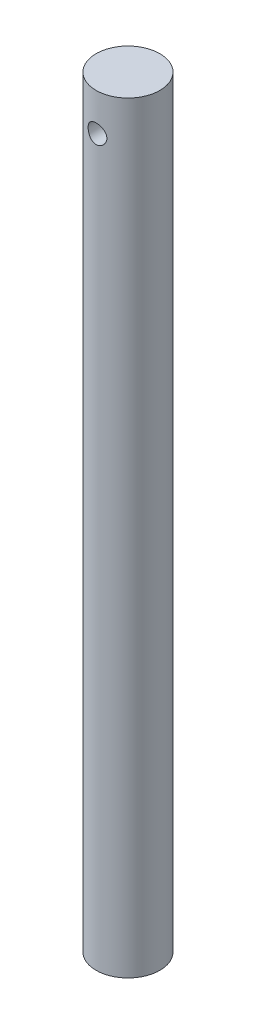
ISO-10303-21;
HEADER;
FILE_DESCRIPTION(('STEP AP214'),'2;1');
FILE_NAME('part.step','',(''),(''),'','','');
FILE_SCHEMA(('AUTOMOTIVE_DESIGN { 1 0 10303 214 1 1 1 1 }'));
ENDSEC;
DATA;
#1=APPLICATION_CONTEXT('core data for automotive mechanical design processes');
#2=APPLICATION_PROTOCOL_DEFINITION('international standard','automotive_design',2000,#1);
#3=PRODUCT_CONTEXT('',#1,'mechanical');
#4=PRODUCT('Part','Part','',(#3));
#5=PRODUCT_RELATED_PRODUCT_CATEGORY('part','',(#4));
#6=PRODUCT_DEFINITION_FORMATION('','',#4);
#7=PRODUCT_DEFINITION_CONTEXT('part definition',#1,'design');
#8=PRODUCT_DEFINITION('design','',#6,#7);
#9=PRODUCT_DEFINITION_SHAPE('','',#8);
#10=(LENGTH_UNIT() NAMED_UNIT(*) SI_UNIT(.MILLI.,.METRE.));
#11=(NAMED_UNIT(*) PLANE_ANGLE_UNIT() SI_UNIT($,.RADIAN.));
#12=(NAMED_UNIT(*) SI_UNIT($,.STERADIAN.) SOLID_ANGLE_UNIT());
#13=UNCERTAINTY_MEASURE_WITH_UNIT(LENGTH_MEASURE(1.E-05),#10,'distance_accuracy_value','');
#14=(GEOMETRIC_REPRESENTATION_CONTEXT(3) GLOBAL_UNCERTAINTY_ASSIGNED_CONTEXT((#13)) GLOBAL_UNIT_ASSIGNED_CONTEXT((#10,
#11,#12)) REPRESENTATION_CONTEXT('',''));
#15=CARTESIAN_POINT('',(0.,0.,0.));
#16=DIRECTION('',(0.,0.,1.));
#17=DIRECTION('',(1.,0.,0.));
#18=AXIS2_PLACEMENT_3D('',#15,#16,#17);
#19=CARTESIAN_POINT('',(0.,203.2,0.));
#20=DIRECTION('',(0.,-1.,0.));
#21=DIRECTION('',(0.,0.,-1.));
#22=AXIS2_PLACEMENT_3D('',#19,#20,#21);
#23=CYLINDRICAL_SURFACE('',#22,8.5);
#24=CARTESIAN_POINT('',(2.5,193.2,8.12403840463596));
#25=CARTESIAN_POINT('',(2.49999796236333,193.062873852835,8.12404004769227));
#26=CARTESIAN_POINT('',(2.48867946345813,192.925727422779,8.12754823490023));
#27=CARTESIAN_POINT('',(2.44381537502387,192.655435183069,8.14114853701026));
#28=CARTESIAN_POINT('',(2.41026169208832,192.522290848594,8.15124304925464));
#29=CARTESIAN_POINT('',(2.32215786618519,192.263954163762,8.1767759728757));
#30=CARTESIAN_POINT('',(2.26764163496267,192.138749348537,8.19220574919405));
#31=CARTESIAN_POINT('',(2.13927079722776,191.899233967044,8.22665909626877));
#32=CARTESIAN_POINT('',(2.06541354228249,191.784924895693,8.2456831591037));
#33=CARTESIAN_POINT('',(1.89805242493169,191.56696890822,8.28583044324545));
#34=CARTESIAN_POINT('',(1.80406342823792,191.463702417056,8.30699705220536));
#35=CARTESIAN_POINT('',(1.60014717785515,191.274146555187,8.34867315787303));
#36=CARTESIAN_POINT('',(1.49021795590314,191.187859284143,8.36918257304957));
#37=CARTESIAN_POINT('',(1.25484804530033,191.033071443225,8.40772468697269));
#38=CARTESIAN_POINT('',(1.12914327438481,190.964956976682,8.42570029093119));
#39=CARTESIAN_POINT('',(0.867445637031216,190.85098011761,8.45664648715187));
#40=CARTESIAN_POINT('',(0.731454905756552,190.805113121516,8.46961811474953));
#41=CARTESIAN_POINT('',(0.457024005838443,190.738187024873,8.48878785171354));
#42=CARTESIAN_POINT('',(0.318754673888333,190.716478972153,8.49516280971316));
#43=CARTESIAN_POINT('',(0.0403993943316189,190.696436873884,8.50104289513883));
#44=CARTESIAN_POINT('',(-0.0996861803221935,190.698098103248,8.50054941131059));
#45=CARTESIAN_POINT('',(-0.373151342435315,190.724307858585,8.49287406928416));
#46=CARTESIAN_POINT('',(-0.506604918733651,190.748153938971,8.48589749488645));
#47=CARTESIAN_POINT('',(-0.767524842762465,190.816911381903,8.46628800888346));
#48=CARTESIAN_POINT('',(-0.894990816659905,190.861824057814,8.45365474462275));
#49=CARTESIAN_POINT('',(-1.14200961129054,190.971926750607,8.42386378069359));
#50=CARTESIAN_POINT('',(-1.26145611323967,191.037341279239,8.40665632319236));
#51=CARTESIAN_POINT('',(-1.48790420805442,191.186414256184,8.3695475929186));
#52=CARTESIAN_POINT('',(-1.59490293229939,191.270076897098,8.34964570148467));
#53=CARTESIAN_POINT('',(-1.79761108283251,191.456930639675,8.30841132230748));
#54=CARTESIAN_POINT('',(-1.89275419933162,191.560731233555,8.28705315309199));
#55=CARTESIAN_POINT('',(-2.06443893360173,191.783025564592,8.24596298173467));
#56=CARTESIAN_POINT('',(-2.14097884894606,191.901520644982,8.2262311285303));
#57=CARTESIAN_POINT('',(-2.27384467334688,192.151282152895,8.190508316972));
#58=CARTESIAN_POINT('',(-2.32998458403206,192.282652874725,8.17455222141957));
#59=CARTESIAN_POINT('',(-2.41918075403472,192.553560502861,8.14860398612285));
#60=CARTESIAN_POINT('',(-2.45224420125603,192.693094851654,8.13860998943288));
#61=CARTESIAN_POINT('',(-2.49330571013839,192.970995992175,8.12612291499099));
#62=CARTESIAN_POINT('',(-2.50216167789634,193.109224603975,8.12337323394746));
#63=CARTESIAN_POINT('',(-2.49694674077671,193.38519477837,8.12497791371988));
#64=CARTESIAN_POINT('',(-2.48287889750256,193.522936403543,8.12933132587803));
#65=CARTESIAN_POINT('',(-2.43297838264223,193.790495744733,8.14440053150527));
#66=CARTESIAN_POINT('',(-2.39769132906183,193.920425118724,8.15495668098142));
#67=CARTESIAN_POINT('',(-2.30698314161101,194.172512602256,8.18107827684707));
#68=CARTESIAN_POINT('',(-2.25155898239259,194.294669540843,8.19664447589366));
#69=CARTESIAN_POINT('',(-2.12050182351162,194.531252226319,8.23153516861892));
#70=CARTESIAN_POINT('',(-2.04438129566146,194.645394737546,8.25094678118232));
#71=CARTESIAN_POINT('',(-1.87467572806314,194.859599956246,8.29115078956271));
#72=CARTESIAN_POINT('',(-1.78108667259489,194.959659416967,8.31194350216197));
#73=CARTESIAN_POINT('',(-1.5750791637806,195.146575157079,8.35347468056185));
#74=CARTESIAN_POINT('',(-1.46210326579578,195.232824962063,8.37418413333273));
#75=CARTESIAN_POINT('',(-1.22279215701974,195.385152819897,8.4124574775909));
#76=CARTESIAN_POINT('',(-1.0964576273572,195.451231900544,8.43002152933273));
#77=CARTESIAN_POINT('',(-0.83486970079801,195.560706524561,8.45991559483805));
#78=CARTESIAN_POINT('',(-0.699692499333715,195.604272872726,8.47228488292635));
#79=CARTESIAN_POINT('',(-0.423508369003444,195.667936053035,8.49056923502441));
#80=CARTESIAN_POINT('',(-0.28250304845032,195.688039315809,8.49648606745733));
#81=CARTESIAN_POINT('',(-0.00428063265452223,195.703732149907,8.50109557993595));
#82=CARTESIAN_POINT('',(0.132883087997766,195.700202944985,8.5000479658633));
#83=CARTESIAN_POINT('',(0.40457987902751,195.670826481531,8.49145383826406));
#84=CARTESIAN_POINT('',(0.539113088331977,195.644980404908,8.48390766890344));
#85=CARTESIAN_POINT('',(0.800430062071601,195.572241393431,8.46323443524756));
#86=CARTESIAN_POINT('',(0.92727771497263,195.525560861568,8.45016376169147));
#87=CARTESIAN_POINT('',(1.17140848295971,195.412667454099,8.41979522614635));
#88=CARTESIAN_POINT('',(1.28869005835389,195.34645144208,8.40249668545172));
#89=CARTESIAN_POINT('',(1.51431862183008,195.1939784527,8.36482735062435));
#90=CARTESIAN_POINT('',(1.62227473752418,195.107162667301,8.34437779354528));
#91=CARTESIAN_POINT('',(1.82238178255149,194.916970534231,8.30297459267524));
#92=CARTESIAN_POINT('',(1.91452822302222,194.813589499227,8.28202080763743));
#93=CARTESIAN_POINT('',(2.08301441277004,194.589686707217,8.24128575203088));
#94=CARTESIAN_POINT('',(2.1588327454279,194.468762509931,8.22155447762225));
#95=CARTESIAN_POINT('',(2.28897091376096,194.215322127327,8.18628031678096));
#96=CARTESIAN_POINT('',(2.34330180082887,194.082811943833,8.17073527860536));
#97=CARTESIAN_POINT('',(2.4236098697108,193.826106943865,8.14724808486323));
#98=CARTESIAN_POINT('',(2.45217950771626,193.702780757797,8.13862442212331));
#99=CARTESIAN_POINT('',(2.49037379107053,193.452975082965,8.12701933690399));
#100=CARTESIAN_POINT('',(2.50000187967973,193.326496171548,8.12403688894885));
#101=CARTESIAN_POINT('',(2.5,193.2,8.12403840463596));
#102=B_SPLINE_CURVE_WITH_KNOTS('',3,(#24,#25,#26,#27,#28,#29,#30,#31,#32,#33,#34,#35,#36,#37,
#38,#39,#40,#41,#42,#43,#44,#45,#46,#47,#48,#49,#50,#51,#52,#53,#54,#55,#56,#57,#58,#59,#60,#61,
#62,#63,#64,#65,#66,#67,#68,#69,#70,#71,#72,#73,#74,#75,#76,#77,#78,#79,#80,#81,#82,#83,#84,#85,
#86,#87,#88,#89,#90,#91,#92,#93,#94,#95,#96,#97,#98,#99,#100,#101),.UNSPECIFIED.,.T.,.F.,(4,2,2,
2,2,2,2,2,2,2,2,2,2,2,2,2,2,2,2,2,2,2,2,2,2,2,2,2,2,2,2,2,2,2,2,2,2,2,4),(0.,0.410912099878071,
0.821973850269874,1.23237339254287,1.64282916164921,2.06459109250966,2.48640514599762,
2.91657307890351,3.34665196116879,3.76487622839168,4.18301593513791,4.58835076674875,
4.9937108716974,5.4036749647982,5.81373334874933,6.23900922160109,6.66432399789826,
7.09342468655066,7.52239165832585,7.93594602558852,8.34944516487447,8.75274111013304,
9.15609767062929,9.56993137756289,9.98386033532176,10.4127208011549,10.8415594108246,
11.2670947877504,11.6925135089525,12.1021596149396,12.5117840272457,12.9173245470081,
13.3229302115836,13.7411394840136,14.1594673033652,14.5896395325794,15.0195902276006,
15.3987174767159,15.7777758003976),.UNSPECIFIED.);
#103=CARTESIAN_POINT('',(2.5,193.2,8.12403840463596));
#104=VERTEX_POINT('',#103);
#105=EDGE_CURVE('E40',#104,#104,#102,.T.);
#106=ORIENTED_EDGE('',*,*,#105,.T.);
#107=EDGE_LOOP('',(#106));
#108=FACE_BOUND('',#107,.T.);
#109=CARTESIAN_POINT('',(0.,195.7,-8.5));
#110=CARTESIAN_POINT('',(-0.137271087727495,195.699998009457,-8.49999861984563));
#111=CARTESIAN_POINT('',(-0.274562388524357,195.688656416097,-8.49664273790941));
#112=CARTESIAN_POINT('',(-0.545154790258969,195.64369228964,-8.48358293092289));
#113=CARTESIAN_POINT('',(-0.678454552902891,195.610062369172,-8.47387690115711));
#114=CARTESIAN_POINT('',(-0.937121397424162,195.52173584907,-8.44918175691691));
#115=CARTESIAN_POINT('',(-1.06249961390222,195.467069621409,-8.4342002617338));
#116=CARTESIAN_POINT('',(-1.30231013795625,195.338344642843,-8.40051609595062));
#117=CARTESIAN_POINT('',(-1.41674111478709,195.264283538379,-8.38181297379899));
#118=CARTESIAN_POINT('',(-1.63457916116328,195.096708257565,-8.34210560637238));
#119=CARTESIAN_POINT('',(-1.73764002919375,195.002754904256,-8.32105559723633));
#120=CARTESIAN_POINT('',(-1.9267934781298,194.798998624703,-8.27930364822076));
#121=CARTESIAN_POINT('',(-2.01288333630681,194.689193160127,-8.25860176467897));
#122=CARTESIAN_POINT('',(-2.16744780421675,194.453951057519,-8.21940889423452));
#123=CARTESIAN_POINT('',(-2.23550435462777,194.328229344143,-8.20097494362387));
#124=CARTESIAN_POINT('',(-2.34936967141106,194.066496243712,-8.16908706562412));
#125=CARTESIAN_POINT('',(-2.39518354658733,193.930487227798,-8.15563199483111));
#126=CARTESIAN_POINT('',(-2.4620230904679,193.6559185785,-8.13570140468483));
#127=CARTESIAN_POINT('',(-2.48368513263949,193.517527179815,-8.12904710882195));
#128=CARTESIAN_POINT('',(-2.50359273858352,193.23892679982,-8.12293921380092));
#129=CARTESIAN_POINT('',(-2.50184372926459,193.098718247273,-8.12348394583797));
#130=CARTESIAN_POINT('',(-2.47547970423777,192.825599058342,-8.1315538217463));
#131=CARTESIAN_POINT('',(-2.45165677002291,192.692603643464,-8.13883715033043));
#132=CARTESIAN_POINT('',(-2.38309882975619,192.432587236949,-8.15917310643882));
#133=CARTESIAN_POINT('',(-2.33836183223036,192.305566815528,-8.17222628337175));
#134=CARTESIAN_POINT('',(-2.22865105602403,192.059145354335,-8.20282771250157));
#135=CARTESIAN_POINT('',(-2.1634166038604,191.939867796497,-8.22043331779315));
#136=CARTESIAN_POINT('',(-2.01474396039616,191.713684624634,-8.25812773273612));
#137=CARTESIAN_POINT('',(-1.93130150587336,191.606781917043,-8.27821712346286));
#138=CARTESIAN_POINT('',(-1.74462617541447,191.403884132737,-8.31960105269041));
#139=CARTESIAN_POINT('',(-1.64073447444152,191.308497468825,-8.34091163205923));
#140=CARTESIAN_POINT('',(-1.41816455436526,191.13636198606,-8.381622169105));
#141=CARTESIAN_POINT('',(-1.29948547582089,191.059614251266,-8.40102201561289));
#142=CARTESIAN_POINT('',(-1.04963424378285,190.926584980096,-8.43589091064938));
#143=CARTESIAN_POINT('',(-0.918388927530007,190.870433804769,-8.4513347411375));
#144=CARTESIAN_POINT('',(-0.647758832686872,190.78117897428,-8.47636980535785));
#145=CARTESIAN_POINT('',(-0.50837624371238,190.748069149743,-8.48596260563203));
#146=CARTESIAN_POINT('',(-0.230604068870085,190.706839110804,-8.4979689702563));
#147=CARTESIAN_POINT('',(-0.092346999228584,190.697893865124,-8.50061946024052));
#148=CARTESIAN_POINT('',(0.183699522477687,190.702940732752,-8.49913508852595));
#149=CARTESIAN_POINT('',(0.321489032058248,190.716929914153,-8.49500109414636));
#150=CARTESIAN_POINT('',(0.589606356734289,190.76677944425,-8.48056702277198));
#151=CARTESIAN_POINT('',(0.720030997169925,190.802161742012,-8.47040180981073));
#152=CARTESIAN_POINT('',(0.973067590228202,190.89322167692,-8.44507681715343));
#153=CARTESIAN_POINT('',(1.09567861561037,190.948901717547,-8.42991644599505));
#154=CARTESIAN_POINT('',(1.33267472471046,191.080387898657,-8.39575167626283));
#155=CARTESIAN_POINT('',(1.44681224267531,191.156619214139,-8.37666836767037));
#156=CARTESIAN_POINT('',(1.66095780157527,191.326524220165,-8.3368520682965));
#157=CARTESIAN_POINT('',(1.76096242617874,191.420202115414,-8.3161186805298));
#158=CARTESIAN_POINT('',(1.94760844001463,191.626214071631,-8.27443627897487));
#159=CARTESIAN_POINT('',(2.03366352285072,191.739084012757,-8.2535048797977));
#160=CARTESIAN_POINT('',(2.18564758513575,191.978116372239,-8.21456767827428));
#161=CARTESIAN_POINT('',(2.25157717122358,192.104278389782,-8.19656178775266));
#162=CARTESIAN_POINT('',(2.36097355864955,192.365857278367,-8.16572337156381));
#163=CARTESIAN_POINT('',(2.40455162576546,192.50122443153,-8.15286529179189));
#164=CARTESIAN_POINT('',(2.46817463572475,192.777821158248,-8.13383292382002));
#165=CARTESIAN_POINT('',(2.48822724822325,192.919048805639,-8.12765645736396));
#166=CARTESIAN_POINT('',(2.50372273821178,193.197283759396,-8.12289540762687));
#167=CARTESIAN_POINT('',(2.50011873506142,193.334233664506,-8.12401678018334));
#168=CARTESIAN_POINT('',(2.47066658625237,193.605482269575,-8.13302148912631));
#169=CARTESIAN_POINT('',(2.44481926783808,193.739781067941,-8.14090457403997));
#170=CARTESIAN_POINT('',(2.37221858991634,194.000423589527,-8.16235114097488));
#171=CARTESIAN_POINT('',(2.32570829969428,194.126840860984,-8.1758484654058));
#172=CARTESIAN_POINT('',(2.21329051947503,194.370178386097,-8.20699285495302));
#173=CARTESIAN_POINT('',(2.14737943045436,194.487096872503,-8.22464068990431));
#174=CARTESIAN_POINT('',(1.99531510587088,194.712564541071,-8.26287240673951));
#175=CARTESIAN_POINT('',(1.90853150291959,194.820674777888,-8.28353771793409));
#176=CARTESIAN_POINT('',(1.71833198876268,195.021106914135,-8.32507032743605));
#177=CARTESIAN_POINT('',(1.61491181950039,195.113424759056,-8.34593767616557));
#178=CARTESIAN_POINT('',(1.39092065602785,195.282196041117,-8.38621639202544));
#179=CARTESIAN_POINT('',(1.26995371609996,195.358138793326,-8.40557136656934));
#180=CARTESIAN_POINT('',(1.01639937119367,195.488499215351,-8.43997966669156));
#181=CARTESIAN_POINT('',(0.883817828157913,195.54292766794,-8.45503514608528));
#182=CARTESIAN_POINT('',(0.626887616598632,195.623417754159,-8.47771488552966));
#183=CARTESIAN_POINT('',(0.503401139075293,195.652060424325,-8.48600430120501));
#184=CARTESIAN_POINT('',(0.25328185434428,195.690351016371,-8.49714708039866));
#185=CARTESIAN_POINT('',(0.126649530199161,195.700001836521,-8.50000127336285));
#186=CARTESIAN_POINT('',(0.,195.7,-8.5));
#187=B_SPLINE_CURVE_WITH_KNOTS('',3,(#109,#110,#111,#112,#113,#114,#115,#116,#117,#118,#119,
#120,#121,#122,#123,#124,#125,#126,#127,#128,#129,#130,#131,#132,#133,#134,#135,#136,#137,#138,
#139,#140,#141,#142,#143,#144,#145,#146,#147,#148,#149,#150,#151,#152,#153,#154,#155,#156,#157,
#158,#159,#160,#161,#162,#163,#164,#165,#166,#167,#168,#169,#170,#171,#172,#173,#174,#175,#176,
#177,#178,#179,#180,#181,#182,#183,#184,#185,#186),.UNSPECIFIED.,.T.,.F.,(4,2,2,2,2,2,2,2,2,2,2,
2,2,2,2,2,2,2,2,2,2,2,2,2,2,2,2,2,2,2,2,2,2,2,2,2,2,2,4),(0.,0.411348192094646,
0.822832792007133,1.23372551088052,1.64466811452448,2.06586180730938,2.48712301902579,
2.91743218534864,3.34764246939178,3.76622762432656,4.1847157488466,4.5887455970191,
4.99281392546436,5.40224443714993,5.81177091596683,6.23770082270502,6.66365549600849,
7.09226143770935,7.52075257496995,7.9344173803943,8.34802930759404,8.75272365258223,
9.15746593349622,9.57132699384868,9.98528792596807,10.4136578800675,10.8420149206203,
11.2682183853916,11.6942828627207,12.1032896825566,12.5122812918013,12.9165841167859,
13.3209619909176,13.7395612758506,14.1582678704127,14.5885807456276,15.0186776776227,
15.3982551130269,15.7777746181136),.UNSPECIFIED.);
#188=CARTESIAN_POINT('',(0.,195.7,-8.5));
#189=VERTEX_POINT('',#188);
#190=EDGE_CURVE('E10',#189,#189,#187,.T.);
#191=ORIENTED_EDGE('',*,*,#190,.T.);
#192=EDGE_LOOP('',(#191));
#193=FACE_BOUND('',#192,.T.);
#194=CARTESIAN_POINT('',(0.,203.2,0.));
#195=DIRECTION('',(0.,1.,0.));
#196=DIRECTION('',(0.,0.,1.));
#197=AXIS2_PLACEMENT_3D('',#194,#195,#196);
#198=CIRCLE('',#197,8.5);
#199=CARTESIAN_POINT('',(0.,203.2,8.5));
#200=VERTEX_POINT('',#199);
#201=EDGE_CURVE('E49',#200,#200,#198,.T.);
#202=ORIENTED_EDGE('',*,*,#201,.F.);
#203=EDGE_LOOP('',(#202));
#204=FACE_BOUND('',#203,.T.);
#205=CARTESIAN_POINT('',(0.,0.,0.));
#206=DIRECTION('',(0.,1.,0.));
#207=DIRECTION('',(0.,0.,1.));
#208=AXIS2_PLACEMENT_3D('',#205,#206,#207);
#209=CIRCLE('',#208,8.5);
#210=CARTESIAN_POINT('',(0.,0.,8.5));
#211=VERTEX_POINT('',#210);
#212=EDGE_CURVE('E54',#211,#211,#209,.T.);
#213=ORIENTED_EDGE('',*,*,#212,.T.);
#214=EDGE_LOOP('',(#213));
#215=FACE_BOUND('',#214,.T.);
#216=ADVANCED_FACE('F36',(#108,#193,#204,#215),#23,.T.);
#217=CARTESIAN_POINT('',(0.,203.2,0.));
#218=DIRECTION('',(0.,1.,0.));
#219=DIRECTION('',(0.,0.,1.));
#220=AXIS2_PLACEMENT_3D('',#217,#218,#219);
#221=PLANE('',#220);
#222=ORIENTED_EDGE('',*,*,#201,.T.);
#223=EDGE_LOOP('',(#222));
#224=FACE_BOUND('',#223,.T.);
#225=ADVANCED_FACE('F66',(#224),#221,.T.);
#226=CARTESIAN_POINT('',(0.,0.,0.));
#227=DIRECTION('',(0.,1.,0.));
#228=DIRECTION('',(0.,0.,1.));
#229=AXIS2_PLACEMENT_3D('',#226,#227,#228);
#230=PLANE('',#229);
#231=ORIENTED_EDGE('',*,*,#212,.F.);
#232=EDGE_LOOP('',(#231));
#233=FACE_BOUND('',#232,.T.);
#234=ADVANCED_FACE('F64',(#233),#230,.F.);
#235=CARTESIAN_POINT('',(0.,193.2,-8.5));
#236=DIRECTION('',(0.,0.,1.));
#237=DIRECTION('',(1.,0.,0.));
#238=AXIS2_PLACEMENT_3D('',#235,#236,#237);
#239=CYLINDRICAL_SURFACE('',#238,2.5);
#240=ORIENTED_EDGE('',*,*,#105,.F.);
#241=EDGE_LOOP('',(#240));
#242=FACE_BOUND('',#241,.T.);
#243=ORIENTED_EDGE('',*,*,#190,.F.);
#244=EDGE_LOOP('',(#243));
#245=FACE_BOUND('',#244,.T.);
#246=ADVANCED_FACE('F60',(#242,#245),#239,.F.);
#247=CLOSED_SHELL('',(#216,#225,#234,#246));
#248=MANIFOLD_SOLID_BREP('B2',#247);
#249=ADVANCED_BREP_SHAPE_REPRESENTATION('',(#18,#248),#14);
#250=SHAPE_DEFINITION_REPRESENTATION(#9,#249);
ENDSEC;
END-ISO-10303-21;
